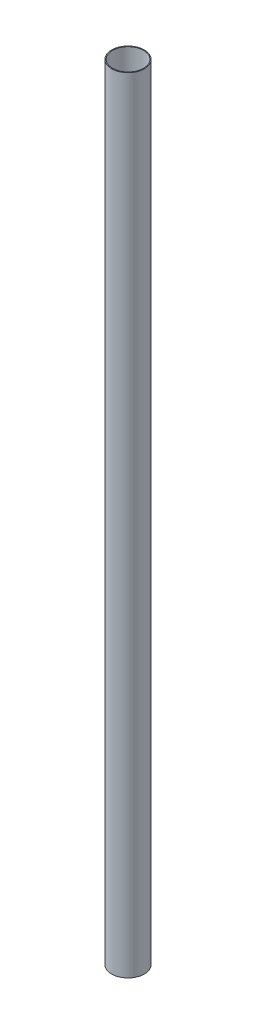
ISO-10303-21;
HEADER;
FILE_DESCRIPTION(('STEP AP214'),'2;1');
FILE_NAME('part.step','',(''),(''),'','','');
FILE_SCHEMA(('AUTOMOTIVE_DESIGN { 1 0 10303 214 1 1 1 1 }'));
ENDSEC;
DATA;
#1=APPLICATION_CONTEXT('core data for automotive mechanical design processes');
#2=APPLICATION_PROTOCOL_DEFINITION('international standard','automotive_design',2000,#1);
#3=PRODUCT_CONTEXT('',#1,'mechanical');
#4=PRODUCT('Part','Part','',(#3));
#5=PRODUCT_RELATED_PRODUCT_CATEGORY('part','',(#4));
#6=PRODUCT_DEFINITION_FORMATION('','',#4);
#7=PRODUCT_DEFINITION_CONTEXT('part definition',#1,'design');
#8=PRODUCT_DEFINITION('design','',#6,#7);
#9=PRODUCT_DEFINITION_SHAPE('','',#8);
#10=(LENGTH_UNIT() NAMED_UNIT(*) SI_UNIT(.MILLI.,.METRE.));
#11=(NAMED_UNIT(*) PLANE_ANGLE_UNIT() SI_UNIT($,.RADIAN.));
#12=(NAMED_UNIT(*) SI_UNIT($,.STERADIAN.) SOLID_ANGLE_UNIT());
#13=UNCERTAINTY_MEASURE_WITH_UNIT(LENGTH_MEASURE(1.E-05),#10,'distance_accuracy_value','');
#14=(GEOMETRIC_REPRESENTATION_CONTEXT(3) GLOBAL_UNCERTAINTY_ASSIGNED_CONTEXT((#13)) GLOBAL_UNIT_ASSIGNED_CONTEXT((#10,
#11,#12)) REPRESENTATION_CONTEXT('',''));
#15=CARTESIAN_POINT('',(0.,0.,0.));
#16=DIRECTION('',(0.,0.,1.));
#17=DIRECTION('',(1.,0.,0.));
#18=AXIS2_PLACEMENT_3D('',#15,#16,#17);
#19=CARTESIAN_POINT('',(0.,2438.4,0.));
#20=DIRECTION('',(0.,1.,0.));
#21=DIRECTION('',(0.,0.,1.));
#22=AXIS2_PLACEMENT_3D('',#19,#20,#21);
#23=PLANE('',#22);
#24=CARTESIAN_POINT('',(0.,2438.4,0.));
#25=DIRECTION('',(0.,1.,0.));
#26=DIRECTION('',(0.,0.,1.));
#27=AXIS2_PLACEMENT_3D('',#24,#25,#26);
#28=CIRCLE('',#27,50.8);
#29=CARTESIAN_POINT('',(0.,2438.4,-50.8));
#30=VERTEX_POINT('',#29);
#31=EDGE_CURVE('E10',#30,#30,#28,.T.);
#32=ORIENTED_EDGE('',*,*,#31,.T.);
#33=EDGE_LOOP('',(#32));
#34=FACE_BOUND('',#33,.T.);
#35=CARTESIAN_POINT('',(0.,2438.4,0.));
#36=DIRECTION('',(0.,1.,0.));
#37=DIRECTION('',(0.,0.,1.));
#38=AXIS2_PLACEMENT_3D('',#35,#36,#37);
#39=CIRCLE('',#38,48.26);
#40=CARTESIAN_POINT('',(0.,2438.4,-48.26));
#41=VERTEX_POINT('',#40);
#42=EDGE_CURVE('E42',#41,#41,#39,.T.);
#43=ORIENTED_EDGE('',*,*,#42,.F.);
#44=EDGE_LOOP('',(#43));
#45=FACE_BOUND('',#44,.T.);
#46=ADVANCED_FACE('F31',(#34,#45),#23,.T.);
#47=CARTESIAN_POINT('',(0.,0.,0.));
#48=DIRECTION('',(0.,1.,0.));
#49=DIRECTION('',(0.,0.,1.));
#50=AXIS2_PLACEMENT_3D('',#47,#48,#49);
#51=PLANE('',#50);
#52=CARTESIAN_POINT('',(0.,0.,0.));
#53=DIRECTION('',(0.,1.,0.));
#54=DIRECTION('',(0.,0.,1.));
#55=AXIS2_PLACEMENT_3D('',#52,#53,#54);
#56=CIRCLE('',#55,50.8);
#57=CARTESIAN_POINT('',(0.,0.,-50.8));
#58=VERTEX_POINT('',#57);
#59=EDGE_CURVE('E35',#58,#58,#56,.T.);
#60=ORIENTED_EDGE('',*,*,#59,.F.);
#61=EDGE_LOOP('',(#60));
#62=FACE_BOUND('',#61,.T.);
#63=CARTESIAN_POINT('',(0.,0.,0.));
#64=DIRECTION('',(0.,1.,0.));
#65=DIRECTION('',(0.,0.,1.));
#66=AXIS2_PLACEMENT_3D('',#63,#64,#65);
#67=CIRCLE('',#66,48.26);
#68=CARTESIAN_POINT('',(0.,0.,-48.26));
#69=VERTEX_POINT('',#68);
#70=EDGE_CURVE('E44',#69,#69,#67,.T.);
#71=ORIENTED_EDGE('',*,*,#70,.T.);
#72=EDGE_LOOP('',(#71));
#73=FACE_BOUND('',#72,.T.);
#74=ADVANCED_FACE('F54',(#62,#73),#51,.F.);
#75=CARTESIAN_POINT('',(0.,2438.4,0.));
#76=DIRECTION('',(0.,-1.,0.));
#77=DIRECTION('',(0.,0.,-1.));
#78=AXIS2_PLACEMENT_3D('',#75,#76,#77);
#79=CYLINDRICAL_SURFACE('',#78,50.8);
#80=CARTESIAN_POINT('',(0.,2438.4,-50.8));
#81=CARTESIAN_POINT('',(0.,2413.,-50.8));
#82=CARTESIAN_POINT('',(0.,2387.6,-50.8));
#83=CARTESIAN_POINT('',(0.,2336.8,-50.8));
#84=CARTESIAN_POINT('',(0.,2311.4,-50.8));
#85=CARTESIAN_POINT('',(0.,2260.6,-50.8));
#86=CARTESIAN_POINT('',(0.,2235.2,-50.8));
#87=CARTESIAN_POINT('',(0.,2184.4,-50.8));
#88=CARTESIAN_POINT('',(0.,2159.,-50.8));
#89=CARTESIAN_POINT('',(0.,2108.2,-50.8));
#90=CARTESIAN_POINT('',(0.,2082.8,-50.8));
#91=CARTESIAN_POINT('',(0.,2032.,-50.8));
#92=CARTESIAN_POINT('',(0.,2006.6,-50.8));
#93=CARTESIAN_POINT('',(0.,1955.8,-50.8));
#94=CARTESIAN_POINT('',(0.,1930.4,-50.8));
#95=CARTESIAN_POINT('',(0.,1879.6,-50.8));
#96=CARTESIAN_POINT('',(0.,1854.2,-50.8));
#97=CARTESIAN_POINT('',(0.,1803.4,-50.8));
#98=CARTESIAN_POINT('',(0.,1778.,-50.8));
#99=CARTESIAN_POINT('',(0.,1727.2,-50.8));
#100=CARTESIAN_POINT('',(0.,1701.8,-50.8));
#101=CARTESIAN_POINT('',(0.,1651.,-50.8));
#102=CARTESIAN_POINT('',(0.,1625.6,-50.8));
#103=CARTESIAN_POINT('',(0.,1574.8,-50.8));
#104=CARTESIAN_POINT('',(0.,1549.4,-50.8));
#105=CARTESIAN_POINT('',(0.,1498.6,-50.8));
#106=CARTESIAN_POINT('',(0.,1473.2,-50.8));
#107=CARTESIAN_POINT('',(0.,1422.4,-50.8));
#108=CARTESIAN_POINT('',(0.,1397.,-50.8));
#109=CARTESIAN_POINT('',(0.,1346.2,-50.8));
#110=CARTESIAN_POINT('',(0.,1320.8,-50.8));
#111=CARTESIAN_POINT('',(0.,1270.,-50.8));
#112=CARTESIAN_POINT('',(0.,1244.6,-50.8));
#113=CARTESIAN_POINT('',(0.,1193.8,-50.8));
#114=CARTESIAN_POINT('',(0.,1168.4,-50.8));
#115=CARTESIAN_POINT('',(0.,1117.6,-50.8));
#116=CARTESIAN_POINT('',(0.,1092.2,-50.8));
#117=CARTESIAN_POINT('',(0.,1041.4,-50.8));
#118=CARTESIAN_POINT('',(0.,1016.,-50.8));
#119=CARTESIAN_POINT('',(0.,965.2,-50.8));
#120=CARTESIAN_POINT('',(0.,939.8,-50.8));
#121=CARTESIAN_POINT('',(0.,889.,-50.8));
#122=CARTESIAN_POINT('',(0.,863.6,-50.8));
#123=CARTESIAN_POINT('',(0.,812.8,-50.8));
#124=CARTESIAN_POINT('',(0.,787.4,-50.8));
#125=CARTESIAN_POINT('',(0.,736.6,-50.8));
#126=CARTESIAN_POINT('',(0.,711.2,-50.8));
#127=CARTESIAN_POINT('',(0.,660.4,-50.8));
#128=CARTESIAN_POINT('',(0.,635.,-50.8));
#129=CARTESIAN_POINT('',(0.,584.2,-50.8));
#130=CARTESIAN_POINT('',(0.,558.8,-50.8));
#131=CARTESIAN_POINT('',(0.,508.,-50.8));
#132=CARTESIAN_POINT('',(0.,482.6,-50.8));
#133=CARTESIAN_POINT('',(0.,431.8,-50.8));
#134=CARTESIAN_POINT('',(0.,406.4,-50.8));
#135=CARTESIAN_POINT('',(0.,355.6,-50.8));
#136=CARTESIAN_POINT('',(0.,330.2,-50.8));
#137=CARTESIAN_POINT('',(0.,279.4,-50.8));
#138=CARTESIAN_POINT('',(0.,254.,-50.8));
#139=CARTESIAN_POINT('',(0.,203.2,-50.8));
#140=CARTESIAN_POINT('',(0.,177.8,-50.8));
#141=CARTESIAN_POINT('',(0.,127.,-50.8));
#142=CARTESIAN_POINT('',(0.,101.6,-50.8));
#143=CARTESIAN_POINT('',(0.,50.8,-50.8));
#144=CARTESIAN_POINT('',(0.,25.4,-50.8));
#145=CARTESIAN_POINT('',(0.,0.,-50.8));
#146=B_SPLINE_CURVE_WITH_KNOTS('',3,(#80,#81,#82,#83,#84,#85,#86,#87,#88,#89,#90,#91,#92,#93,
#94,#95,#96,#97,#98,#99,#100,#101,#102,#103,#104,#105,#106,#107,#108,#109,#110,#111,#112,#113,
#114,#115,#116,#117,#118,#119,#120,#121,#122,#123,#124,#125,#126,#127,#128,#129,#130,#131,#132,
#133,#134,#135,#136,#137,#138,#139,#140,#141,#142,#143,#144,#145),.UNSPECIFIED.,.F.,.F.,(4,2,2,
2,2,2,2,2,2,2,2,2,2,2,2,2,2,2,2,2,2,2,2,2,2,2,2,2,2,2,2,2,4),(0.,76.2,152.4,228.6,304.8,381.,
457.2,533.4,609.6,685.8,762.,838.2,914.4,990.6,1066.8,1143.,1219.2,1295.4,1371.6,1447.8,1524.,
1600.2,1676.4,1752.6,1828.8,1905.,1981.2,2057.4,2133.6,2209.8,2286.,2362.2,2438.4),.UNSPECIFIED.);
#147=EDGE_CURVE('BSEAM33',#30,#58,#146,.T.);
#148=ORIENTED_EDGE('',*,*,#31,.F.);
#149=ORIENTED_EDGE('',*,*,#59,.T.);
#150=ORIENTED_EDGE('',*,*,#147,.T.);
#151=ORIENTED_EDGE('',*,*,#147,.F.);
#152=EDGE_LOOP('',(#148,#150,#149,#151));
#153=FACE_BOUND('',#152,.T.);
#154=ADVANCED_FACE('F33',(#153),#79,.T.);
#155=CARTESIAN_POINT('',(0.,2438.4,0.));
#156=DIRECTION('',(0.,-1.,0.));
#157=DIRECTION('',(0.,0.,-1.));
#158=AXIS2_PLACEMENT_3D('',#155,#156,#157);
#159=CYLINDRICAL_SURFACE('',#158,48.26);
#160=CARTESIAN_POINT('',(0.,2438.4,-48.26));
#161=CARTESIAN_POINT('',(0.,2413.,-48.26));
#162=CARTESIAN_POINT('',(0.,2387.6,-48.26));
#163=CARTESIAN_POINT('',(0.,2336.8,-48.26));
#164=CARTESIAN_POINT('',(0.,2311.4,-48.26));
#165=CARTESIAN_POINT('',(0.,2260.6,-48.26));
#166=CARTESIAN_POINT('',(0.,2235.2,-48.26));
#167=CARTESIAN_POINT('',(0.,2184.4,-48.26));
#168=CARTESIAN_POINT('',(0.,2159.,-48.26));
#169=CARTESIAN_POINT('',(0.,2108.2,-48.26));
#170=CARTESIAN_POINT('',(0.,2082.8,-48.26));
#171=CARTESIAN_POINT('',(0.,2032.,-48.26));
#172=CARTESIAN_POINT('',(0.,2006.6,-48.26));
#173=CARTESIAN_POINT('',(0.,1955.8,-48.26));
#174=CARTESIAN_POINT('',(0.,1930.4,-48.26));
#175=CARTESIAN_POINT('',(0.,1879.6,-48.26));
#176=CARTESIAN_POINT('',(0.,1854.2,-48.26));
#177=CARTESIAN_POINT('',(0.,1803.4,-48.26));
#178=CARTESIAN_POINT('',(0.,1778.,-48.26));
#179=CARTESIAN_POINT('',(0.,1727.2,-48.26));
#180=CARTESIAN_POINT('',(0.,1701.8,-48.26));
#181=CARTESIAN_POINT('',(0.,1651.,-48.26));
#182=CARTESIAN_POINT('',(0.,1625.6,-48.26));
#183=CARTESIAN_POINT('',(0.,1574.8,-48.26));
#184=CARTESIAN_POINT('',(0.,1549.4,-48.26));
#185=CARTESIAN_POINT('',(0.,1498.6,-48.26));
#186=CARTESIAN_POINT('',(0.,1473.2,-48.26));
#187=CARTESIAN_POINT('',(0.,1422.4,-48.26));
#188=CARTESIAN_POINT('',(0.,1397.,-48.26));
#189=CARTESIAN_POINT('',(0.,1346.2,-48.26));
#190=CARTESIAN_POINT('',(0.,1320.8,-48.26));
#191=CARTESIAN_POINT('',(0.,1270.,-48.26));
#192=CARTESIAN_POINT('',(0.,1244.6,-48.26));
#193=CARTESIAN_POINT('',(0.,1193.8,-48.26));
#194=CARTESIAN_POINT('',(0.,1168.4,-48.26));
#195=CARTESIAN_POINT('',(0.,1117.6,-48.26));
#196=CARTESIAN_POINT('',(0.,1092.2,-48.26));
#197=CARTESIAN_POINT('',(0.,1041.4,-48.26));
#198=CARTESIAN_POINT('',(0.,1016.,-48.26));
#199=CARTESIAN_POINT('',(0.,965.2,-48.26));
#200=CARTESIAN_POINT('',(0.,939.8,-48.26));
#201=CARTESIAN_POINT('',(0.,889.,-48.26));
#202=CARTESIAN_POINT('',(0.,863.6,-48.26));
#203=CARTESIAN_POINT('',(0.,812.8,-48.26));
#204=CARTESIAN_POINT('',(0.,787.4,-48.26));
#205=CARTESIAN_POINT('',(0.,736.6,-48.26));
#206=CARTESIAN_POINT('',(0.,711.2,-48.26));
#207=CARTESIAN_POINT('',(0.,660.4,-48.26));
#208=CARTESIAN_POINT('',(0.,635.,-48.26));
#209=CARTESIAN_POINT('',(0.,584.2,-48.26));
#210=CARTESIAN_POINT('',(0.,558.8,-48.26));
#211=CARTESIAN_POINT('',(0.,508.,-48.26));
#212=CARTESIAN_POINT('',(0.,482.6,-48.26));
#213=CARTESIAN_POINT('',(0.,431.8,-48.26));
#214=CARTESIAN_POINT('',(0.,406.4,-48.26));
#215=CARTESIAN_POINT('',(0.,355.6,-48.26));
#216=CARTESIAN_POINT('',(0.,330.2,-48.26));
#217=CARTESIAN_POINT('',(0.,279.4,-48.26));
#218=CARTESIAN_POINT('',(0.,254.,-48.26));
#219=CARTESIAN_POINT('',(0.,203.2,-48.26));
#220=CARTESIAN_POINT('',(0.,177.8,-48.26));
#221=CARTESIAN_POINT('',(0.,127.,-48.26));
#222=CARTESIAN_POINT('',(0.,101.6,-48.26));
#223=CARTESIAN_POINT('',(0.,50.8,-48.26));
#224=CARTESIAN_POINT('',(0.,25.4,-48.26));
#225=CARTESIAN_POINT('',(0.,0.,-48.26));
#226=B_SPLINE_CURVE_WITH_KNOTS('',3,(#160,#161,#162,#163,#164,#165,#166,#167,#168,#169,#170,
#171,#172,#173,#174,#175,#176,#177,#178,#179,#180,#181,#182,#183,#184,#185,#186,#187,#188,#189,
#190,#191,#192,#193,#194,#195,#196,#197,#198,#199,#200,#201,#202,#203,#204,#205,#206,#207,#208,
#209,#210,#211,#212,#213,#214,#215,#216,#217,#218,#219,#220,#221,#222,#223,#224,#225),
.UNSPECIFIED.,.F.,.F.,(4,2,2,2,2,2,2,2,2,2,2,2,2,2,2,2,2,2,2,2,2,2,2,2,2,2,2,2,2,2,2,2,4),(0.,
76.2,152.4,228.6,304.8,381.,457.2,533.4,609.6,685.8,762.,838.2,914.4,990.6,1066.8,1143.,1219.2,
1295.4,1371.6,1447.8,1524.,1600.2,1676.4,1752.6,1828.8,1905.,1981.2,2057.4,2133.6,2209.8,2286.,
2362.2,2438.4),.UNSPECIFIED.);
#227=EDGE_CURVE('BSEAM50',#41,#69,#226,.T.);
#228=ORIENTED_EDGE('',*,*,#42,.T.);
#229=ORIENTED_EDGE('',*,*,#70,.F.);
#230=ORIENTED_EDGE('',*,*,#227,.T.);
#231=ORIENTED_EDGE('',*,*,#227,.F.);
#232=EDGE_LOOP('',(#228,#230,#229,#231));
#233=FACE_BOUND('',#232,.T.);
#234=ADVANCED_FACE('F50',(#233),#159,.F.);
#235=CLOSED_SHELL('',(#46,#74,#154,#234));
#236=MANIFOLD_SOLID_BREP('B2',#235);
#237=ADVANCED_BREP_SHAPE_REPRESENTATION('',(#18,#236),#14);
#238=SHAPE_DEFINITION_REPRESENTATION(#9,#237);
ENDSEC;
END-ISO-10303-21;
